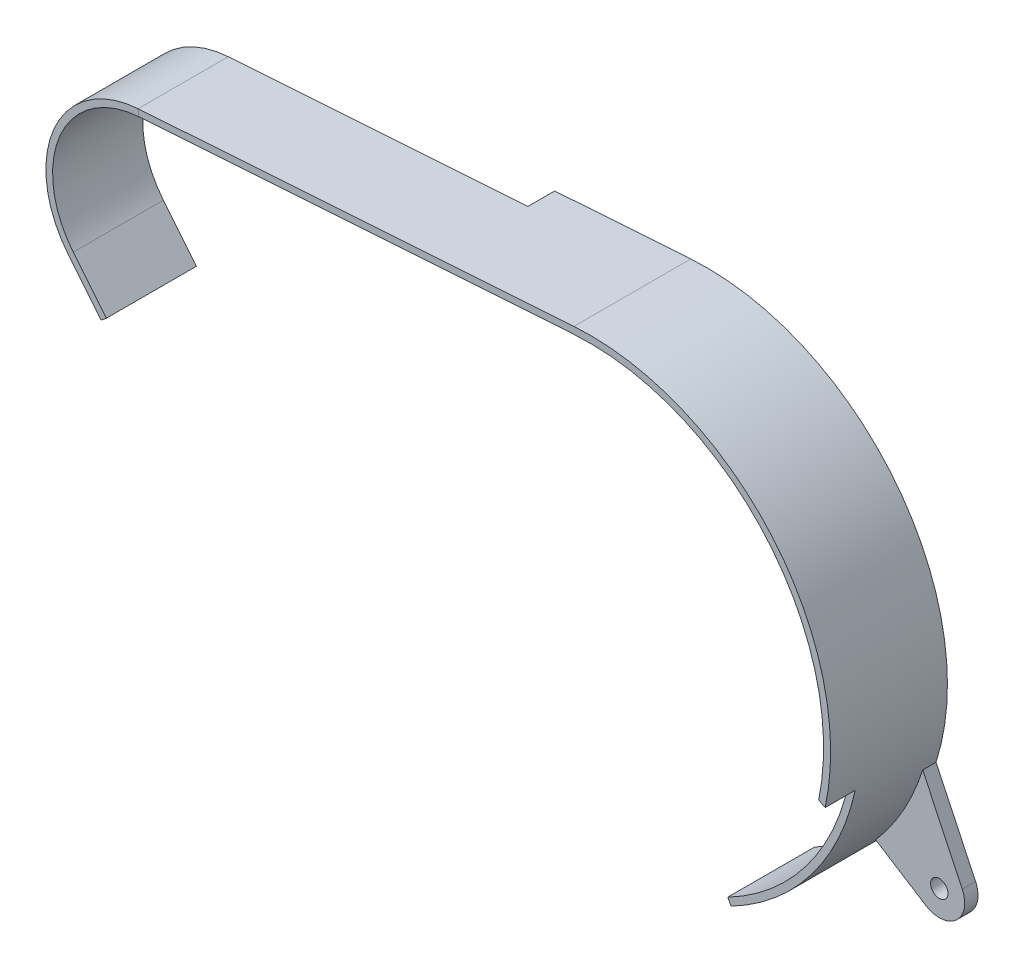
ISO-10303-21;
HEADER;
FILE_DESCRIPTION(('STEP AP214'),'2;1');
FILE_NAME('part.step','',(''),(''),'','','');
FILE_SCHEMA(('AUTOMOTIVE_DESIGN { 1 0 10303 214 1 1 1 1 }'));
ENDSEC;
DATA;
#1=APPLICATION_CONTEXT('core data for automotive mechanical design processes');
#2=APPLICATION_PROTOCOL_DEFINITION('international standard','automotive_design',2000,#1);
#3=PRODUCT_CONTEXT('',#1,'mechanical');
#4=PRODUCT('Part','Part','',(#3));
#5=PRODUCT_RELATED_PRODUCT_CATEGORY('part','',(#4));
#6=PRODUCT_DEFINITION_FORMATION('','',#4);
#7=PRODUCT_DEFINITION_CONTEXT('part definition',#1,'design');
#8=PRODUCT_DEFINITION('design','',#6,#7);
#9=PRODUCT_DEFINITION_SHAPE('','',#8);
#10=(LENGTH_UNIT() NAMED_UNIT(*) SI_UNIT(.MILLI.,.METRE.));
#11=(NAMED_UNIT(*) PLANE_ANGLE_UNIT() SI_UNIT($,.RADIAN.));
#12=(NAMED_UNIT(*) SI_UNIT($,.STERADIAN.) SOLID_ANGLE_UNIT());
#13=UNCERTAINTY_MEASURE_WITH_UNIT(LENGTH_MEASURE(1.E-05),#10,'distance_accuracy_value','');
#14=(GEOMETRIC_REPRESENTATION_CONTEXT(3) GLOBAL_UNCERTAINTY_ASSIGNED_CONTEXT((#13)) GLOBAL_UNIT_ASSIGNED_CONTEXT((#10,
#11,#12)) REPRESENTATION_CONTEXT('',''));
#15=CARTESIAN_POINT('',(0.,0.,0.));
#16=DIRECTION('',(0.,0.,1.));
#17=DIRECTION('',(1.,0.,0.));
#18=AXIS2_PLACEMENT_3D('',#15,#16,#17);
#19=CARTESIAN_POINT('',(0.,0.,22.225));
#20=DIRECTION('',(0.,0.,-1.));
#21=DIRECTION('',(-1.,0.,0.));
#22=AXIS2_PLACEMENT_3D('',#19,#20,#21);
#23=CYLINDRICAL_SURFACE('',#22,37.592);
#24=DIRECTION('',(0.,0.,-1.));
#25=VECTOR('',#24,1.);
#26=CARTESIAN_POINT('',(-2.50080697256526,37.5087246982081,22.225));
#27=LINE('',#26,#25);
#28=CARTESIAN_POINT('',(-2.50080697256526,37.5087246982081,22.225));
#29=VERTEX_POINT('',#28);
#30=CARTESIAN_POINT('',(-2.50080697256526,37.5087246982081,-12.065));
#31=VERTEX_POINT('',#30);
#32=EDGE_CURVE('E95',#29,#31,#27,.T.);
#33=ORIENTED_EDGE('',*,*,#32,.T.);
#34=CARTESIAN_POINT('',(0.,0.,-12.065));
#35=DIRECTION('',(0.,0.,-1.));
#36=DIRECTION('',(-1.,0.,0.));
#37=AXIS2_PLACEMENT_3D('',#34,#35,#36);
#38=CIRCLE('',#37,37.592);
#39=CARTESIAN_POINT('',(-29.159882495619,-23.7246647361284,-12.065));
#40=VERTEX_POINT('',#39);
#41=EDGE_CURVE('E49',#31,#40,#38,.F.);
#42=ORIENTED_EDGE('',*,*,#41,.T.);
#43=DIRECTION('',(0.,0.,1.));
#44=VECTOR('',#43,1.);
#45=CARTESIAN_POINT('',(-29.159882495619,-23.7246647361284,-22.225));
#46=LINE('',#45,#44);
#47=CARTESIAN_POINT('',(-29.159882495619,-23.7246647361284,22.225));
#48=VERTEX_POINT('',#47);
#49=EDGE_CURVE('E106',#40,#48,#46,.T.);
#50=ORIENTED_EDGE('',*,*,#49,.T.);
#51=CARTESIAN_POINT('',(0.,0.,22.225));
#52=DIRECTION('',(0.,0.,1.));
#53=DIRECTION('',(1.,0.,0.));
#54=AXIS2_PLACEMENT_3D('',#51,#52,#53);
#55=CIRCLE('',#54,37.592);
#56=EDGE_CURVE('E104',#29,#48,#55,.T.);
#57=ORIENTED_EDGE('',*,*,#56,.F.);
#58=EDGE_LOOP('',(#33,#42,#50,#57));
#59=FACE_BOUND('',#58,.T.);
#60=ADVANCED_FACE('F46',(#59),#23,.T.);
#61=CARTESIAN_POINT('',(0.,0.,22.225));
#62=DIRECTION('',(0.,0.,-1.));
#63=DIRECTION('',(-1.,0.,0.));
#64=AXIS2_PLACEMENT_3D('',#61,#62,#63);
#65=CYLINDRICAL_SURFACE('',#64,35.052);
#66=CARTESIAN_POINT('',(0.,0.,-12.065));
#67=DIRECTION('',(0.,0.,1.));
#68=DIRECTION('',(1.,0.,0.));
#69=AXIS2_PLACEMENT_3D('',#66,#67,#68);
#70=CIRCLE('',#69,35.052);
#71=CARTESIAN_POINT('',(-2.33183352847302,34.9743514077887,-12.065));
#72=VERTEX_POINT('',#71);
#73=CARTESIAN_POINT('',(-27.1896201648339,-22.1216468485522,-12.065));
#74=VERTEX_POINT('',#73);
#75=EDGE_CURVE('E135',#72,#74,#70,.T.);
#76=ORIENTED_EDGE('',*,*,#75,.F.);
#77=DIRECTION('',(0.,0.,-1.));
#78=VECTOR('',#77,1.);
#79=CARTESIAN_POINT('',(-2.33183352847302,34.9743514077887,22.225));
#80=LINE('',#79,#78);
#81=CARTESIAN_POINT('',(-2.33183352847302,34.9743514077887,22.225));
#82=VERTEX_POINT('',#81);
#83=EDGE_CURVE('E111',#82,#72,#80,.T.);
#84=ORIENTED_EDGE('',*,*,#83,.F.);
#85=CARTESIAN_POINT('',(0.,0.,22.225));
#86=DIRECTION('',(0.,0.,1.));
#87=DIRECTION('',(1.,0.,0.));
#88=AXIS2_PLACEMENT_3D('',#85,#86,#87);
#89=CIRCLE('',#88,35.052);
#90=CARTESIAN_POINT('',(-27.1896201648339,-22.1216468485522,22.225));
#91=VERTEX_POINT('',#90);
#92=EDGE_CURVE('E117',#82,#91,#89,.T.);
#93=ORIENTED_EDGE('',*,*,#92,.T.);
#94=DIRECTION('',(0.,0.,1.));
#95=VECTOR('',#94,1.);
#96=CARTESIAN_POINT('',(-27.1896201648339,-22.1216468485522,-22.225));
#97=LINE('',#96,#95);
#98=EDGE_CURVE('E122',#74,#91,#97,.T.);
#99=ORIENTED_EDGE('',*,*,#98,.F.);
#100=EDGE_LOOP('',(#76,#84,#93,#99));
#101=FACE_BOUND('',#100,.T.);
#102=ADVANCED_FACE('F155',(#101),#65,.F.);
#103=CARTESIAN_POINT('',(-2.50080697256526,37.5087246982081,22.225));
#104=DIRECTION('',(0.997784760007665,0.0665249779890738,0.));
#105=DIRECTION('',(-0.0665249779890738,0.997784760007665,0.));
#106=AXIS2_PLACEMENT_3D('',#103,#104,#105);
#107=PLANE('',#106);
#108=DIRECTION('',(0.0665249779890738,-0.997784760007665,0.));
#109=VECTOR('',#108,1.);
#110=CARTESIAN_POINT('',(-2.50080697256526,37.5087246982081,-12.065));
#111=LINE('',#110,#109);
#112=EDGE_CURVE('E101',#31,#72,#111,.T.);
#113=ORIENTED_EDGE('',*,*,#112,.F.);
#114=ORIENTED_EDGE('',*,*,#32,.F.);
#115=DIRECTION('',(0.0665249779890737,-0.997784760007665,0.));
#116=VECTOR('',#115,1.);
#117=CARTESIAN_POINT('',(-2.50080697256526,37.5087246982081,22.225));
#118=LINE('',#117,#116);
#119=EDGE_CURVE('E100',#29,#82,#118,.T.);
#120=ORIENTED_EDGE('',*,*,#119,.T.);
#121=ORIENTED_EDGE('',*,*,#83,.T.);
#122=EDGE_LOOP('',(#113,#114,#120,#121));
#123=FACE_BOUND('',#122,.T.);
#124=ADVANCED_FACE('F97',(#123),#107,.T.);
#125=CARTESIAN_POINT('',(0.,0.,22.225));
#126=DIRECTION('',(0.,0.,1.));
#127=DIRECTION('',(1.,0.,0.));
#128=AXIS2_PLACEMENT_3D('',#125,#126,#127);
#129=PLANE('',#128);
#130=ORIENTED_EDGE('',*,*,#56,.T.);
#131=DIRECTION('',(0.631109404557577,-0.775693831017742,0.));
#132=VECTOR('',#131,1.);
#133=CARTESIAN_POINT('',(-29.159882495619,-23.7246647361284,22.225));
#134=LINE('',#133,#132);
#135=CARTESIAN_POINT('',(-16.573105373909,-39.1950178875762,22.225));
#136=VERTEX_POINT('',#135);
#137=EDGE_CURVE('E110',#48,#136,#134,.T.);
#138=ORIENTED_EDGE('',*,*,#137,.T.);
#139=DIRECTION('',(0.775693831017742,0.631109404557577,0.));
#140=VECTOR('',#139,1.);
#141=CARTESIAN_POINT('',(-16.573105373909,-39.1950178875762,22.225));
#142=LINE('',#141,#140);
#143=CARTESIAN_POINT('',(-14.6028430431239,-37.592,22.225));
#144=VERTEX_POINT('',#143);
#145=EDGE_CURVE('E131',#136,#144,#142,.T.);
#146=ORIENTED_EDGE('',*,*,#145,.T.);
#147=DIRECTION('',(-0.631109404557577,0.775693831017742,0.));
#148=VECTOR('',#147,1.);
#149=CARTESIAN_POINT('',(-27.1896201648339,-22.1216468485522,22.225));
#150=LINE('',#149,#148);
#151=EDGE_CURVE('E125',#144,#91,#150,.T.);
#152=ORIENTED_EDGE('',*,*,#151,.T.);
#153=ORIENTED_EDGE('',*,*,#92,.F.);
#154=ORIENTED_EDGE('',*,*,#119,.F.);
#155=EDGE_LOOP('',(#130,#138,#146,#152,#153,#154));
#156=FACE_BOUND('',#155,.T.);
#157=ADVANCED_FACE('F114',(#156),#129,.T.);
#158=CARTESIAN_POINT('',(-27.1896201648339,-22.1216468485522,-22.225));
#159=DIRECTION('',(0.775693831017742,0.631109404557577,0.));
#160=DIRECTION('',(-0.631109404557577,0.775693831017742,0.));
#161=AXIS2_PLACEMENT_3D('',#158,#159,#160);
#162=PLANE('',#161);
#163=DIRECTION('',(0.631109404557577,-0.775693831017742,0.));
#164=VECTOR('',#163,1.);
#165=CARTESIAN_POINT('',(-27.1896201648339,-22.1216468485522,-12.065));
#166=LINE('',#165,#164);
#167=CARTESIAN_POINT('',(-14.6028430431239,-37.592,-12.065));
#168=VERTEX_POINT('',#167);
#169=EDGE_CURVE('E137',#74,#168,#166,.T.);
#170=ORIENTED_EDGE('',*,*,#169,.F.);
#171=ORIENTED_EDGE('',*,*,#98,.T.);
#172=ORIENTED_EDGE('',*,*,#151,.F.);
#173=DIRECTION('',(0.,0.,1.));
#174=VECTOR('',#173,1.);
#175=CARTESIAN_POINT('',(-14.6028430431239,-37.592,-22.225));
#176=LINE('',#175,#174);
#177=EDGE_CURVE('E124',#168,#144,#176,.T.);
#178=ORIENTED_EDGE('',*,*,#177,.F.);
#179=EDGE_LOOP('',(#170,#171,#172,#178));
#180=FACE_BOUND('',#179,.T.);
#181=ADVANCED_FACE('F151',(#180),#162,.T.);
#182=CARTESIAN_POINT('',(-16.573105373909,-39.1950178875762,-22.225));
#183=DIRECTION('',(0.631109404557577,-0.775693831017742,0.));
#184=DIRECTION('',(0.775693831017742,0.631109404557577,0.));
#185=AXIS2_PLACEMENT_3D('',#182,#183,#184);
#186=PLANE('',#185);
#187=DIRECTION('',(-0.775693831017742,-0.631109404557577,0.));
#188=VECTOR('',#187,1.);
#189=CARTESIAN_POINT('',(-16.573105373909,-39.1950178875762,-12.065));
#190=LINE('',#189,#188);
#191=CARTESIAN_POINT('',(-16.573105373909,-39.1950178875762,-12.065));
#192=VERTEX_POINT('',#191);
#193=EDGE_CURVE('E54',#168,#192,#190,.T.);
#194=ORIENTED_EDGE('',*,*,#193,.F.);
#195=ORIENTED_EDGE('',*,*,#177,.T.);
#196=ORIENTED_EDGE('',*,*,#145,.F.);
#197=DIRECTION('',(0.,0.,1.));
#198=VECTOR('',#197,1.);
#199=CARTESIAN_POINT('',(-16.573105373909,-39.1950178875762,-22.225));
#200=LINE('',#199,#198);
#201=EDGE_CURVE('E127',#192,#136,#200,.T.);
#202=ORIENTED_EDGE('',*,*,#201,.F.);
#203=EDGE_LOOP('',(#194,#195,#196,#202));
#204=FACE_BOUND('',#203,.T.);
#205=ADVANCED_FACE('F148',(#204),#186,.T.);
#206=CARTESIAN_POINT('',(-29.159882495619,-23.7246647361284,-22.225));
#207=DIRECTION('',(-0.775693831017741,-0.631109404557577,0.));
#208=DIRECTION('',(0.631109404557577,-0.775693831017742,0.));
#209=AXIS2_PLACEMENT_3D('',#206,#207,#208);
#210=PLANE('',#209);
#211=DIRECTION('',(-0.631109404557577,0.775693831017742,0.));
#212=VECTOR('',#211,1.);
#213=CARTESIAN_POINT('',(-29.159882495619,-23.7246647361284,-12.065));
#214=LINE('',#213,#212);
#215=EDGE_CURVE('E12',#192,#40,#214,.T.);
#216=ORIENTED_EDGE('',*,*,#215,.F.);
#217=ORIENTED_EDGE('',*,*,#201,.T.);
#218=ORIENTED_EDGE('',*,*,#137,.F.);
#219=ORIENTED_EDGE('',*,*,#49,.F.);
#220=EDGE_LOOP('',(#216,#217,#218,#219));
#221=FACE_BOUND('',#220,.T.);
#222=ADVANCED_FACE('F146',(#221),#210,.T.);
#223=CARTESIAN_POINT('',(-27.954100766528,-144.176402638146,-12.065));
#224=DIRECTION('',(0.,0.,1.));
#225=DIRECTION('',(1.,0.,0.));
#226=AXIS2_PLACEMENT_3D('',#223,#224,#225);
#227=PLANE('',#226);
#228=ORIENTED_EDGE('',*,*,#112,.T.);
#229=ORIENTED_EDGE('',*,*,#75,.T.);
#230=ORIENTED_EDGE('',*,*,#169,.T.);
#231=ORIENTED_EDGE('',*,*,#193,.T.);
#232=ORIENTED_EDGE('',*,*,#215,.T.);
#233=ORIENTED_EDGE('',*,*,#41,.F.);
#234=EDGE_LOOP('',(#228,#229,#230,#231,#232,#233));
#235=FACE_BOUND('',#234,.T.);
#236=ADVANCED_FACE('F140',(#235),#227,.F.);
#237=CLOSED_SHELL('',(#60,#102,#124,#157,#181,#205,#222,#236));
#238=MANIFOLD_SOLID_BREP('B2',#237);
#239=CARTESIAN_POINT('',(211.675704331162,-123.90501,22.225));
#240=DIRECTION('',(-0.887142857142856,-0.461494908986448,0.));
#241=DIRECTION('',(0.461494908986448,-0.887142857142856,0.));
#242=AXIS2_PLACEMENT_3D('',#239,#240,#241);
#243=PLANE('',#242);
#244=DIRECTION('',(0.,0.,-1.));
#245=VECTOR('',#244,1.);
#246=CARTESIAN_POINT('',(211.675704331162,-123.90501,22.225));
#247=LINE('',#246,#245);
#248=CARTESIAN_POINT('',(211.675704331162,-123.90501,10.795));
#249=VERTEX_POINT('',#248);
#250=CARTESIAN_POINT('',(211.675704331162,-123.90501,-22.225));
#251=VERTEX_POINT('',#250);
#252=EDGE_CURVE('E433',#249,#251,#247,.T.);
#253=ORIENTED_EDGE('',*,*,#252,.F.);
#254=DIRECTION('',(0.461494908986448,-0.887142857142856,0.));
#255=VECTOR('',#254,1.);
#256=CARTESIAN_POINT('',(210.444897408895,-121.539,10.795));
#257=LINE('',#256,#255);
#258=CARTESIAN_POINT('',(210.444897408895,-121.539,10.795));
#259=VERTEX_POINT('',#258);
#260=EDGE_CURVE('E391',#259,#249,#257,.T.);
#261=ORIENTED_EDGE('',*,*,#260,.F.);
#262=DIRECTION('',(0.,0.,-1.));
#263=VECTOR('',#262,1.);
#264=CARTESIAN_POINT('',(210.444897408895,-121.539,22.225));
#265=LINE('',#264,#263);
#266=CARTESIAN_POINT('',(210.444897408895,-121.539,-22.225));
#267=VERTEX_POINT('',#266);
#268=EDGE_CURVE('E445',#259,#267,#265,.T.);
#269=ORIENTED_EDGE('',*,*,#268,.T.);
#270=DIRECTION('',(-0.461494908986448,0.887142857142856,0.));
#271=VECTOR('',#270,1.);
#272=CARTESIAN_POINT('',(211.675704331162,-123.90501,-22.225));
#273=LINE('',#272,#271);
#274=EDGE_CURVE('E428',#251,#267,#273,.T.);
#275=ORIENTED_EDGE('',*,*,#274,.F.);
#276=EDGE_LOOP('',(#253,#261,#269,#275));
#277=FACE_BOUND('',#276,.T.);
#278=ADVANCED_FACE('F224',(#277),#243,.T.);
#279=CARTESIAN_POINT('',(163.503929456771,46.0310651646814,22.225));
#280=DIRECTION('',(-0.997784760007665,-0.0665249779890679,0.));
#281=DIRECTION('',(0.0665249779890679,-0.997784760007665,0.));
#282=AXIS2_PLACEMENT_3D('',#279,#280,#281);
#283=PLANE('',#282);
#284=DIRECTION('',(-0.0665249779890679,0.997784760007665,0.));
#285=VECTOR('',#284,1.);
#286=CARTESIAN_POINT('',(163.503929456771,46.0310651646814,22.225));
#287=LINE('',#286,#285);
#288=CARTESIAN_POINT('',(163.503929456771,46.0310651646814,22.225));
#289=VERTEX_POINT('',#288);
#290=CARTESIAN_POINT('',(163.495480833897,46.1577830893155,22.225));
#291=VERTEX_POINT('',#290);
#292=EDGE_CURVE('E427',#289,#291,#287,.T.);
#293=ORIENTED_EDGE('',*,*,#292,.T.);
#294=DIRECTION('',(0.,0.,-1.));
#295=VECTOR('',#294,1.);
#296=CARTESIAN_POINT('',(163.495480833897,46.1577830893155,22.225));
#297=LINE('',#296,#295);
#298=CARTESIAN_POINT('',(163.495480833897,46.1577830893155,-22.225));
#299=VERTEX_POINT('',#298);
#300=EDGE_CURVE('E421',#291,#299,#297,.T.);
#301=ORIENTED_EDGE('',*,*,#300,.T.);
#302=DIRECTION('',(-0.0665249779890679,0.997784760007665,0.));
#303=VECTOR('',#302,1.);
#304=CARTESIAN_POINT('',(163.503929456771,46.0310651646814,-22.225));
#305=LINE('',#304,#303);
#306=CARTESIAN_POINT('',(163.503929456771,46.0310651646814,-22.225));
#307=VERTEX_POINT('',#306);
#308=EDGE_CURVE('E436',#307,#299,#305,.T.);
#309=ORIENTED_EDGE('',*,*,#308,.F.);
#310=DIRECTION('',(0.,0.,-1.));
#311=VECTOR('',#310,1.);
#312=CARTESIAN_POINT('',(163.503929456771,46.0310651646814,22.225));
#313=LINE('',#312,#311);
#314=EDGE_CURVE('E447',#289,#307,#313,.T.);
#315=ORIENTED_EDGE('',*,*,#314,.F.);
#316=EDGE_LOOP('',(#293,#301,#309,#315));
#317=FACE_BOUND('',#316,.T.);
#318=ADVANCED_FACE('F510',(#317),#283,.T.);
#319=CARTESIAN_POINT('',(169.418,-42.672,22.225));
#320=DIRECTION('',(0.,0.,-1.));
#321=DIRECTION('',(-1.,0.,0.));
#322=AXIS2_PLACEMENT_3D('',#319,#320,#321);
#323=CYLINDRICAL_SURFACE('',#322,91.567);
#324=CARTESIAN_POINT('',(169.417999999978,-42.671999999987,-17.145));
#325=DIRECTION('',(0.,0.,1.));
#326=DIRECTION('',(-1.,0.,0.));
#327=AXIS2_PLACEMENT_3D('',#324,#325,#326);
#328=CIRCLE('',#327,91.5670000000249);
#329=CARTESIAN_POINT('',(238.763068572818,-102.469800575198,-17.145));
#330=VERTEX_POINT('',#329);
#331=CARTESIAN_POINT('',(256.655241043143,-70.4960770589174,-17.145));
#332=VERTEX_POINT('',#331);
#333=EDGE_CURVE('E368',#330,#332,#328,.T.);
#334=ORIENTED_EDGE('',*,*,#333,.T.);
#335=DIRECTION('',(0.,0.,-1.));
#336=VECTOR('',#335,1.);
#337=CARTESIAN_POINT('',(256.655241043143,-70.4960770589175,-17.145));
#338=LINE('',#337,#336);
#339=CARTESIAN_POINT('',(256.655241043143,-70.4960770589175,-22.225));
#340=VERTEX_POINT('',#339);
#341=EDGE_CURVE('E384',#332,#340,#338,.T.);
#342=ORIENTED_EDGE('',*,*,#341,.T.);
#343=CARTESIAN_POINT('',(169.418,-42.672,-22.225));
#344=DIRECTION('',(0.,0.,1.));
#345=DIRECTION('',(1.,0.,0.));
#346=AXIS2_PLACEMENT_3D('',#343,#344,#345);
#347=CIRCLE('',#346,91.567);
#348=CARTESIAN_POINT('',(163.326507340474,48.6921571196218,-22.225));
#349=VERTEX_POINT('',#348);
#350=EDGE_CURVE('E424',#340,#349,#347,.T.);
#351=ORIENTED_EDGE('',*,*,#350,.T.);
#352=DIRECTION('',(0.,0.,-1.));
#353=VECTOR('',#352,1.);
#354=CARTESIAN_POINT('',(163.326507340474,48.6921571196218,22.225));
#355=LINE('',#354,#353);
#356=CARTESIAN_POINT('',(163.326507340474,48.6921571196218,22.225));
#357=VERTEX_POINT('',#356);
#358=EDGE_CURVE('E232',#357,#349,#355,.T.);
#359=ORIENTED_EDGE('',*,*,#358,.F.);
#360=CARTESIAN_POINT('',(169.418,-42.672,22.225));
#361=DIRECTION('',(0.,0.,1.));
#362=DIRECTION('',(1.,0.,0.));
#363=AXIS2_PLACEMENT_3D('',#360,#361,#362);
#364=CIRCLE('',#363,91.567);
#365=CARTESIAN_POINT('',(258.897135787805,-62.1142156059331,22.225));
#366=VERTEX_POINT('',#365);
#367=EDGE_CURVE('E425',#366,#357,#364,.T.);
#368=ORIENTED_EDGE('',*,*,#367,.F.);
#369=DIRECTION('',(0.,0.,1.));
#370=VECTOR('',#369,1.);
#371=CARTESIAN_POINT('',(258.897135787805,-62.1142156059331,10.795));
#372=LINE('',#371,#370);
#373=CARTESIAN_POINT('',(258.897135787805,-62.1142156059331,10.795));
#374=VERTEX_POINT('',#373);
#375=EDGE_CURVE('E398',#374,#366,#372,.T.);
#376=ORIENTED_EDGE('',*,*,#375,.F.);
#377=CARTESIAN_POINT('',(169.417999999999,-42.6719999999996,10.795));
#378=DIRECTION('',(0.,0.,1.));
#379=DIRECTION('',(1.,0.,0.));
#380=AXIS2_PLACEMENT_3D('',#377,#378,#379);
#381=CIRCLE('',#380,91.5670000000006);
#382=EDGE_CURVE('E393',#249,#374,#381,.T.);
#383=ORIENTED_EDGE('',*,*,#382,.F.);
#384=ORIENTED_EDGE('',*,*,#252,.T.);
#385=CARTESIAN_POINT('',(238.763068572818,-102.469800575198,-22.225));
#386=VERTEX_POINT('',#385);
#387=EDGE_CURVE('E434',#251,#386,#347,.T.);
#388=ORIENTED_EDGE('',*,*,#387,.T.);
#389=DIRECTION('',(0.,0.,-1.));
#390=VECTOR('',#389,1.);
#391=CARTESIAN_POINT('',(238.763068572818,-102.469800575198,-17.145));
#392=LINE('',#391,#390);
#393=EDGE_CURVE('E246',#330,#386,#392,.T.);
#394=ORIENTED_EDGE('',*,*,#393,.F.);
#395=EDGE_LOOP('',(#334,#342,#351,#359,#368,#376,#383,#384,#388,#394));
#396=FACE_BOUND('',#395,.T.);
#397=ADVANCED_FACE('F226',(#396),#323,.T.);
#398=CARTESIAN_POINT('',(169.418,-42.672,22.225));
#399=DIRECTION('',(0.,0.,-1.));
#400=DIRECTION('',(-1.,0.,0.));
#401=AXIS2_PLACEMENT_3D('',#398,#399,#400);
#402=CYLINDRICAL_SURFACE('',#401,88.9);
#403=DIRECTION('',(0.,0.,1.));
#404=VECTOR('',#403,1.);
#405=CARTESIAN_POINT('',(256.451184619791,-60.7947695162036,10.795));
#406=LINE('',#405,#404);
#407=CARTESIAN_POINT('',(256.451184619791,-60.7947695162036,10.795));
#408=VERTEX_POINT('',#407);
#409=CARTESIAN_POINT('',(256.451184619791,-60.7947695162036,22.225));
#410=VERTEX_POINT('',#409);
#411=EDGE_CURVE('E400',#408,#410,#406,.T.);
#412=ORIENTED_EDGE('',*,*,#411,.T.);
#413=CARTESIAN_POINT('',(169.418,-42.672,22.225));
#414=DIRECTION('',(0.,0.,1.));
#415=DIRECTION('',(1.,0.,0.));
#416=AXIS2_PLACEMENT_3D('',#413,#414,#415);
#417=CIRCLE('',#416,88.9);
#418=EDGE_CURVE('E431',#410,#289,#417,.T.);
#419=ORIENTED_EDGE('',*,*,#418,.T.);
#420=ORIENTED_EDGE('',*,*,#314,.T.);
#421=CARTESIAN_POINT('',(169.418,-42.672,-22.225));
#422=DIRECTION('',(0.,0.,1.));
#423=DIRECTION('',(1.,0.,0.));
#424=AXIS2_PLACEMENT_3D('',#421,#422,#423);
#425=CIRCLE('',#424,88.9);
#426=EDGE_CURVE('E439',#267,#307,#425,.T.);
#427=ORIENTED_EDGE('',*,*,#426,.F.);
#428=ORIENTED_EDGE('',*,*,#268,.F.);
#429=CARTESIAN_POINT('',(169.417999999999,-42.6719999999994,10.795));
#430=DIRECTION('',(0.,0.,-1.));
#431=DIRECTION('',(1.,0.,0.));
#432=AXIS2_PLACEMENT_3D('',#429,#430,#431);
#433=CIRCLE('',#432,88.9000000000008);
#434=EDGE_CURVE('E389',#408,#259,#433,.T.);
#435=ORIENTED_EDGE('',*,*,#434,.F.);
#436=EDGE_LOOP('',(#412,#419,#420,#427,#428,#435));
#437=FACE_BOUND('',#436,.T.);
#438=ADVANCED_FACE('F475',(#437),#402,.F.);
#439=CARTESIAN_POINT('',(169.418,-42.672,22.225));
#440=DIRECTION('',(0.,0.,1.));
#441=DIRECTION('',(1.,0.,0.));
#442=AXIS2_PLACEMENT_3D('',#439,#440,#441);
#443=PLANE('',#442);
#444=DIRECTION('',(-0.880111044298597,0.474767890346043,0.));
#445=VECTOR('',#444,1.);
#446=CARTESIAN_POINT('',(258.897135787805,-62.114215605933,22.225));
#447=LINE('',#446,#445);
#448=EDGE_CURVE('E383',#366,#410,#447,.T.);
#449=ORIENTED_EDGE('',*,*,#448,.F.);
#450=ORIENTED_EDGE('',*,*,#367,.T.);
#451=DIRECTION('',(0.99773363556557,0.0672873870878433,0.));
#452=VECTOR('',#451,1.);
#453=CARTESIAN_POINT('',(-2.50080697256526,37.5087246982081,22.225));
#454=LINE('',#453,#452);
#455=CARTESIAN_POINT('',(-2.50080697256526,37.5087246982081,22.225));
#456=VERTEX_POINT('',#455);
#457=EDGE_CURVE('E408',#456,#357,#454,.T.);
#458=ORIENTED_EDGE('',*,*,#457,.F.);
#459=DIRECTION('',(-0.0672873870878433,0.99773363556557,0.));
#460=VECTOR('',#459,1.);
#461=CARTESIAN_POINT('',(-2.32989700936214,34.9744812638716,22.225));
#462=LINE('',#461,#460);
#463=CARTESIAN_POINT('',(-2.32989700936214,34.9744812638716,22.225));
#464=VERTEX_POINT('',#463);
#465=EDGE_CURVE('E411',#464,#456,#462,.T.);
#466=ORIENTED_EDGE('',*,*,#465,.F.);
#467=DIRECTION('',(0.997733635565571,0.0672873870878433,0.));
#468=VECTOR('',#467,1.);
#469=CARTESIAN_POINT('',(-2.32989700936214,34.9744812638716,22.225));
#470=LINE('',#469,#468);
#471=EDGE_CURVE('E405',#464,#291,#470,.T.);
#472=ORIENTED_EDGE('',*,*,#471,.T.);
#473=ORIENTED_EDGE('',*,*,#292,.F.);
#474=ORIENTED_EDGE('',*,*,#418,.F.);
#475=EDGE_LOOP('',(#449,#450,#458,#466,#472,#473,#474));
#476=FACE_BOUND('',#475,.T.);
#477=ADVANCED_FACE('F467',(#476),#443,.T.);
#478=CARTESIAN_POINT('',(169.418,-42.672,-22.225));
#479=DIRECTION('',(0.,0.,1.));
#480=DIRECTION('',(1.,0.,0.));
#481=AXIS2_PLACEMENT_3D('',#478,#479,#480);
#482=PLANE('',#481);
#483=DIRECTION('',(0.997733635565571,0.0672873870878433,0.));
#484=VECTOR('',#483,1.);
#485=CARTESIAN_POINT('',(-2.32989700936214,34.9744812638716,-22.225));
#486=LINE('',#485,#484);
#487=CARTESIAN_POINT('',(111.711057535783,42.6654296080121,-22.225));
#488=VERTEX_POINT('',#487);
#489=EDGE_CURVE('E403',#488,#299,#486,.T.);
#490=ORIENTED_EDGE('',*,*,#489,.F.);
#491=DIRECTION('',(-0.0672873870878433,0.997733635565571,0.));
#492=VECTOR('',#491,1.);
#493=CARTESIAN_POINT('',(123.622316351184,-133.954054018811,-22.225));
#494=LINE('',#493,#492);
#495=CARTESIAN_POINT('',(111.540147572579,45.1996730423486,-22.225));
#496=VERTEX_POINT('',#495);
#497=EDGE_CURVE('E337',#488,#496,#494,.T.);
#498=ORIENTED_EDGE('',*,*,#497,.T.);
#499=DIRECTION('',(0.99773363556557,0.0672873870878433,0.));
#500=VECTOR('',#499,1.);
#501=CARTESIAN_POINT('',(-2.50080697256526,37.5087246982081,-22.225));
#502=LINE('',#501,#500);
#503=EDGE_CURVE('E348',#496,#349,#502,.T.);
#504=ORIENTED_EDGE('',*,*,#503,.T.);
#505=ORIENTED_EDGE('',*,*,#350,.F.);
#506=DIRECTION('',(0.428194461363711,-0.90368661783687,0.));
#507=VECTOR('',#506,1.);
#508=CARTESIAN_POINT('',(271.699365720833,-102.246077058917,-22.225));
#509=LINE('',#508,#507);
#510=CARTESIAN_POINT('',(271.699365720833,-102.246077058917,-22.225));
#511=VERTEX_POINT('',#510);
#512=EDGE_CURVE('E365',#340,#511,#509,.T.);
#513=ORIENTED_EDGE('',*,*,#512,.T.);
#514=CARTESIAN_POINT('',(262.976982485471,-106.37901,-22.225));
#515=DIRECTION('',(0.,0.,-1.));
#516=DIRECTION('',(-1.,0.,0.));
#517=AXIS2_PLACEMENT_3D('',#514,#515,#516);
#518=CIRCLE('',#517,9.652);
#519=CARTESIAN_POINT('',(257.813068572818,-114.533462593688,-22.225));
#520=VERTEX_POINT('',#519);
#521=EDGE_CURVE('E358',#511,#520,#518,.T.);
#522=ORIENTED_EDGE('',*,*,#521,.T.);
#523=DIRECTION('',(-0.844845896569411,0.535009729864634,0.));
#524=VECTOR('',#523,1.);
#525=CARTESIAN_POINT('',(257.813068572818,-114.533462593688,-22.225));
#526=LINE('',#525,#524);
#527=EDGE_CURVE('E376',#520,#386,#526,.T.);
#528=ORIENTED_EDGE('',*,*,#527,.T.);
#529=ORIENTED_EDGE('',*,*,#387,.F.);
#530=ORIENTED_EDGE('',*,*,#274,.T.);
#531=ORIENTED_EDGE('',*,*,#426,.T.);
#532=ORIENTED_EDGE('',*,*,#308,.T.);
#533=EDGE_LOOP('',(#490,#498,#504,#505,#513,#522,#528,#529,#530,#531,#532));
#534=FACE_BOUND('',#533,.T.);
#535=CARTESIAN_POINT('',(262.976982485471,-106.37901,-22.225));
#536=DIRECTION('',(0.,0.,-1.));
#537=DIRECTION('',(-1.,0.,0.));
#538=AXIS2_PLACEMENT_3D('',#535,#536,#537);
#539=CIRCLE('',#538,3.30200000000004);
#540=CARTESIAN_POINT('',(259.674982485471,-106.37901,-22.225));
#541=VERTEX_POINT('',#540);
#542=EDGE_CURVE('E354',#541,#541,#539,.T.);
#543=ORIENTED_EDGE('',*,*,#542,.F.);
#544=EDGE_LOOP('',(#543));
#545=FACE_BOUND('',#544,.T.);
#546=ADVANCED_FACE('F457',(#534,#545),#482,.F.);
#547=CARTESIAN_POINT('',(-2.32989700936214,34.9744812638716,22.225));
#548=DIRECTION('',(-0.0672873870878433,0.99773363556557,0.));
#549=DIRECTION('',(-0.997733635565571,-0.0672873870878433,0.));
#550=AXIS2_PLACEMENT_3D('',#547,#548,#549);
#551=PLANE('',#550);
#552=DIRECTION('',(0.997733635565571,0.0672873870878433,0.));
#553=VECTOR('',#552,1.);
#554=CARTESIAN_POINT('',(-2.32989700936214,34.9744812638716,-12.065));
#555=LINE('',#554,#553);
#556=CARTESIAN_POINT('',(-2.32989700936214,34.9744812638716,-12.065));
#557=VERTEX_POINT('',#556);
#558=CARTESIAN_POINT('',(111.711057535783,42.665429608012,-12.065));
#559=VERTEX_POINT('',#558);
#560=EDGE_CURVE('E238',#557,#559,#555,.T.);
#561=ORIENTED_EDGE('',*,*,#560,.T.);
#562=DIRECTION('',(0.,0.,-1.));
#563=VECTOR('',#562,1.);
#564=CARTESIAN_POINT('',(111.711057535783,42.6654296080121,22.2249999999998));
#565=LINE('',#564,#563);
#566=EDGE_CURVE('E336',#559,#488,#565,.T.);
#567=ORIENTED_EDGE('',*,*,#566,.T.);
#568=ORIENTED_EDGE('',*,*,#489,.T.);
#569=ORIENTED_EDGE('',*,*,#300,.F.);
#570=ORIENTED_EDGE('',*,*,#471,.F.);
#571=DIRECTION('',(0.,0.,-1.));
#572=VECTOR('',#571,1.);
#573=CARTESIAN_POINT('',(-2.32989700936214,34.9744812638716,22.225));
#574=LINE('',#573,#572);
#575=EDGE_CURVE('E414',#464,#557,#574,.T.);
#576=ORIENTED_EDGE('',*,*,#575,.T.);
#577=EDGE_LOOP('',(#561,#567,#568,#569,#570,#576));
#578=FACE_BOUND('',#577,.T.);
#579=ADVANCED_FACE('F460',(#578),#551,.F.);
#580=CARTESIAN_POINT('',(-2.50080697256526,37.5087246982081,22.225));
#581=DIRECTION('',(-0.0672873870878433,0.997733635565571,0.));
#582=DIRECTION('',(-0.997733635565571,-0.0672873870878433,0.));
#583=AXIS2_PLACEMENT_3D('',#580,#581,#582);
#584=PLANE('',#583);
#585=DIRECTION('',(0.,0.,-1.));
#586=VECTOR('',#585,1.);
#587=CARTESIAN_POINT('',(111.540147572579,45.1996730423486,-22.225));
#588=LINE('',#587,#586);
#589=CARTESIAN_POINT('',(111.540147572579,45.1996730423486,-12.065));
#590=VERTEX_POINT('',#589);
#591=EDGE_CURVE('E333',#590,#496,#588,.T.);
#592=ORIENTED_EDGE('',*,*,#591,.F.);
#593=DIRECTION('',(0.99773363556557,0.0672873870878433,0.));
#594=VECTOR('',#593,1.);
#595=CARTESIAN_POINT('',(-40.0362695451327,34.9773244230135,-12.065));
#596=LINE('',#595,#594);
#597=CARTESIAN_POINT('',(-2.50080697256527,37.5087246982081,-12.065));
#598=VERTEX_POINT('',#597);
#599=EDGE_CURVE('E340',#598,#590,#596,.T.);
#600=ORIENTED_EDGE('',*,*,#599,.F.);
#601=DIRECTION('',(0.,0.,-1.));
#602=VECTOR('',#601,1.);
#603=CARTESIAN_POINT('',(-2.50080697256526,37.5087246982081,22.225));
#604=LINE('',#603,#602);
#605=EDGE_CURVE('E419',#456,#598,#604,.T.);
#606=ORIENTED_EDGE('',*,*,#605,.F.);
#607=ORIENTED_EDGE('',*,*,#457,.T.);
#608=ORIENTED_EDGE('',*,*,#358,.T.);
#609=ORIENTED_EDGE('',*,*,#503,.F.);
#610=EDGE_LOOP('',(#592,#600,#606,#607,#608,#609));
#611=FACE_BOUND('',#610,.T.);
#612=ADVANCED_FACE('F346',(#611),#584,.T.);
#613=CARTESIAN_POINT('',(-2.32989700936214,34.9744812638716,22.225));
#614=DIRECTION('',(-0.99773363556557,-0.0672873870878433,0.));
#615=DIRECTION('',(0.0672873870878433,-0.997733635565571,0.));
#616=AXIS2_PLACEMENT_3D('',#613,#614,#615);
#617=PLANE('',#616);
#618=DIRECTION('',(-0.0672873870878433,0.997733635565571,0.));
#619=VECTOR('',#618,1.);
#620=CARTESIAN_POINT('',(-2.32989700936214,34.9744812638716,-12.065));
#621=LINE('',#620,#619);
#622=EDGE_CURVE('E44',#557,#598,#621,.T.);
#623=ORIENTED_EDGE('',*,*,#622,.F.);
#624=ORIENTED_EDGE('',*,*,#575,.F.);
#625=ORIENTED_EDGE('',*,*,#465,.T.);
#626=ORIENTED_EDGE('',*,*,#605,.T.);
#627=EDGE_LOOP('',(#623,#624,#625,#626));
#628=FACE_BOUND('',#627,.T.);
#629=ADVANCED_FACE('F464',(#628),#617,.T.);
#630=CARTESIAN_POINT('',(258.897135787805,-62.114215605933,10.795));
#631=DIRECTION('',(0.474767890346043,0.880111044298597,0.));
#632=DIRECTION('',(-0.880111044298597,0.474767890346043,0.));
#633=AXIS2_PLACEMENT_3D('',#630,#631,#632);
#634=PLANE('',#633);
#635=ORIENTED_EDGE('',*,*,#448,.T.);
#636=ORIENTED_EDGE('',*,*,#411,.F.);
#637=DIRECTION('',(-0.880111044298597,0.474767890346043,0.));
#638=VECTOR('',#637,1.);
#639=CARTESIAN_POINT('',(258.897135787805,-62.114215605933,10.795));
#640=LINE('',#639,#638);
#641=EDGE_CURVE('E395',#374,#408,#640,.T.);
#642=ORIENTED_EDGE('',*,*,#641,.F.);
#643=ORIENTED_EDGE('',*,*,#375,.T.);
#644=EDGE_LOOP('',(#635,#636,#642,#643));
#645=FACE_BOUND('',#644,.T.);
#646=ADVANCED_FACE('F471',(#645),#634,.F.);
#647=CARTESIAN_POINT('',(169.417999999999,-42.6719999999994,10.795));
#648=DIRECTION('',(0.,0.,1.));
#649=DIRECTION('',(1.,0.,0.));
#650=AXIS2_PLACEMENT_3D('',#647,#648,#649);
#651=PLANE('',#650);
#652=ORIENTED_EDGE('',*,*,#434,.T.);
#653=ORIENTED_EDGE('',*,*,#260,.T.);
#654=ORIENTED_EDGE('',*,*,#382,.T.);
#655=ORIENTED_EDGE('',*,*,#641,.T.);
#656=EDGE_LOOP('',(#652,#653,#654,#655));
#657=FACE_BOUND('',#656,.T.);
#658=ADVANCED_FACE('F481',(#657),#651,.T.);
#659=CARTESIAN_POINT('',(262.976982485471,-106.37901,-17.145));
#660=DIRECTION('',(0.,0.,-1.));
#661=DIRECTION('',(-1.,0.,0.));
#662=AXIS2_PLACEMENT_3D('',#659,#660,#661);
#663=CYLINDRICAL_SURFACE('',#662,9.652);
#664=ORIENTED_EDGE('',*,*,#521,.F.);
#665=DIRECTION('',(0.,0.,-1.));
#666=VECTOR('',#665,1.);
#667=CARTESIAN_POINT('',(271.699365720833,-102.246077058917,-17.145));
#668=LINE('',#667,#666);
#669=CARTESIAN_POINT('',(271.699365720833,-102.246077058917,-17.145));
#670=VERTEX_POINT('',#669);
#671=EDGE_CURVE('E381',#670,#511,#668,.T.);
#672=ORIENTED_EDGE('',*,*,#671,.F.);
#673=CARTESIAN_POINT('',(262.976982485471,-106.37901,-17.145));
#674=DIRECTION('',(0.,0.,-1.));
#675=DIRECTION('',(-1.,0.,0.));
#676=AXIS2_PLACEMENT_3D('',#673,#674,#675);
#677=CIRCLE('',#676,9.652);
#678=CARTESIAN_POINT('',(257.813068572818,-114.533462593688,-17.145));
#679=VERTEX_POINT('',#678);
#680=EDGE_CURVE('E361',#670,#679,#677,.T.);
#681=ORIENTED_EDGE('',*,*,#680,.T.);
#682=DIRECTION('',(0.,0.,-1.));
#683=VECTOR('',#682,1.);
#684=CARTESIAN_POINT('',(257.813068572818,-114.533462593688,-17.145));
#685=LINE('',#684,#683);
#686=EDGE_CURVE('E373',#679,#520,#685,.T.);
#687=ORIENTED_EDGE('',*,*,#686,.T.);
#688=EDGE_LOOP('',(#664,#672,#681,#687));
#689=FACE_BOUND('',#688,.T.);
#690=ADVANCED_FACE('F497',(#689),#663,.T.);
#691=CARTESIAN_POINT('',(271.699365720833,-102.246077058917,-17.145));
#692=DIRECTION('',(0.90368661783687,0.428194461363711,0.));
#693=DIRECTION('',(-0.428194461363711,0.90368661783687,0.));
#694=AXIS2_PLACEMENT_3D('',#691,#692,#693);
#695=PLANE('',#694);
#696=ORIENTED_EDGE('',*,*,#512,.F.);
#697=ORIENTED_EDGE('',*,*,#341,.F.);
#698=DIRECTION('',(0.428194461363711,-0.90368661783687,0.));
#699=VECTOR('',#698,1.);
#700=CARTESIAN_POINT('',(271.699365720833,-102.246077058917,-17.145));
#701=LINE('',#700,#699);
#702=EDGE_CURVE('E370',#332,#670,#701,.T.);
#703=ORIENTED_EDGE('',*,*,#702,.T.);
#704=ORIENTED_EDGE('',*,*,#671,.T.);
#705=EDGE_LOOP('',(#696,#697,#703,#704));
#706=FACE_BOUND('',#705,.T.);
#707=ADVANCED_FACE('F499',(#706),#695,.T.);
#708=CARTESIAN_POINT('',(257.813068572818,-114.533462593688,-17.145));
#709=DIRECTION('',(-0.535009729864634,-0.844845896569411,0.));
#710=DIRECTION('',(0.844845896569411,-0.535009729864634,0.));
#711=AXIS2_PLACEMENT_3D('',#708,#709,#710);
#712=PLANE('',#711);
#713=ORIENTED_EDGE('',*,*,#527,.F.);
#714=ORIENTED_EDGE('',*,*,#686,.F.);
#715=DIRECTION('',(-0.844845896569411,0.535009729864634,0.));
#716=VECTOR('',#715,1.);
#717=CARTESIAN_POINT('',(257.813068572818,-114.533462593688,-17.145));
#718=LINE('',#717,#716);
#719=EDGE_CURVE('E364',#679,#330,#718,.T.);
#720=ORIENTED_EDGE('',*,*,#719,.T.);
#721=ORIENTED_EDGE('',*,*,#393,.T.);
#722=EDGE_LOOP('',(#713,#714,#720,#721));
#723=FACE_BOUND('',#722,.T.);
#724=ADVANCED_FACE('F490',(#723),#712,.T.);
#725=CARTESIAN_POINT('',(262.976982485471,-106.37901,-17.145));
#726=DIRECTION('',(0.,0.,-1.));
#727=DIRECTION('',(-1.,0.,0.));
#728=AXIS2_PLACEMENT_3D('',#725,#726,#727);
#729=PLANE('',#728);
#730=CARTESIAN_POINT('',(262.976982485471,-106.37901,-17.145));
#731=DIRECTION('',(0.,0.,-1.));
#732=DIRECTION('',(-1.,0.,0.));
#733=AXIS2_PLACEMENT_3D('',#730,#731,#732);
#734=CIRCLE('',#733,3.30200000000004);
#735=CARTESIAN_POINT('',(259.674982485471,-106.37901,-17.145));
#736=VERTEX_POINT('',#735);
#737=EDGE_CURVE('E355',#736,#736,#734,.T.);
#738=ORIENTED_EDGE('',*,*,#737,.T.);
#739=EDGE_LOOP('',(#738));
#740=FACE_BOUND('',#739,.T.);
#741=ORIENTED_EDGE('',*,*,#680,.F.);
#742=ORIENTED_EDGE('',*,*,#702,.F.);
#743=ORIENTED_EDGE('',*,*,#333,.F.);
#744=ORIENTED_EDGE('',*,*,#719,.F.);
#745=EDGE_LOOP('',(#741,#742,#743,#744));
#746=FACE_BOUND('',#745,.T.);
#747=ADVANCED_FACE('F494',(#740,#746),#729,.F.);
#748=CARTESIAN_POINT('',(262.976982485471,-106.37901,-17.145));
#749=DIRECTION('',(0.,0.,-1.));
#750=DIRECTION('',(-1.,0.,0.));
#751=AXIS2_PLACEMENT_3D('',#748,#749,#750);
#752=CYLINDRICAL_SURFACE('',#751,3.30200000000004);
#753=ORIENTED_EDGE('',*,*,#737,.F.);
#754=EDGE_LOOP('',(#753));
#755=FACE_BOUND('',#754,.T.);
#756=ORIENTED_EDGE('',*,*,#542,.T.);
#757=EDGE_LOOP('',(#756));
#758=FACE_BOUND('',#757,.T.);
#759=ADVANCED_FACE('F593',(#755,#758),#752,.F.);
#760=CARTESIAN_POINT('',(123.622316351184,-133.954054018811,-22.225));
#761=DIRECTION('',(0.997733635565571,0.0672873870878433,0.));
#762=DIRECTION('',(-0.0672873870878433,0.997733635565571,0.));
#763=AXIS2_PLACEMENT_3D('',#760,#761,#762);
#764=PLANE('',#763);
#765=DIRECTION('',(-0.0672873870878433,0.997733635565571,0.));
#766=VECTOR('',#765,1.);
#767=CARTESIAN_POINT('',(123.622316351184,-133.954054018811,-12.065));
#768=LINE('',#767,#766);
#769=EDGE_CURVE('E329',#559,#590,#768,.T.);
#770=ORIENTED_EDGE('',*,*,#769,.T.);
#771=ORIENTED_EDGE('',*,*,#591,.T.);
#772=ORIENTED_EDGE('',*,*,#497,.F.);
#773=ORIENTED_EDGE('',*,*,#566,.F.);
#774=EDGE_LOOP('',(#770,#771,#772,#773));
#775=FACE_BOUND('',#774,.T.);
#776=ADVANCED_FACE('F331',(#775),#764,.F.);
#777=CARTESIAN_POINT('',(-27.954100766528,-144.176402638146,-12.065));
#778=DIRECTION('',(0.,0.,1.));
#779=DIRECTION('',(1.,0.,0.));
#780=AXIS2_PLACEMENT_3D('',#777,#778,#779);
#781=PLANE('',#780);
#782=ORIENTED_EDGE('',*,*,#622,.T.);
#783=ORIENTED_EDGE('',*,*,#599,.T.);
#784=ORIENTED_EDGE('',*,*,#769,.F.);
#785=ORIENTED_EDGE('',*,*,#560,.F.);
#786=EDGE_LOOP('',(#782,#783,#784,#785));
#787=FACE_BOUND('',#786,.T.);
#788=ADVANCED_FACE('F341',(#787),#781,.F.);
#789=CLOSED_SHELL('',(#278,#318,#397,#438,#477,#546,#579,#612,#629,#646,#658,#690,#707,#724,
#747,#759,#776,#788));
#790=MANIFOLD_SOLID_BREP('B6',#789);
#791=ADVANCED_BREP_SHAPE_REPRESENTATION('',(#18,#238,#790),#14);
#792=SHAPE_DEFINITION_REPRESENTATION(#9,#791);
ENDSEC;
END-ISO-10303-21;
